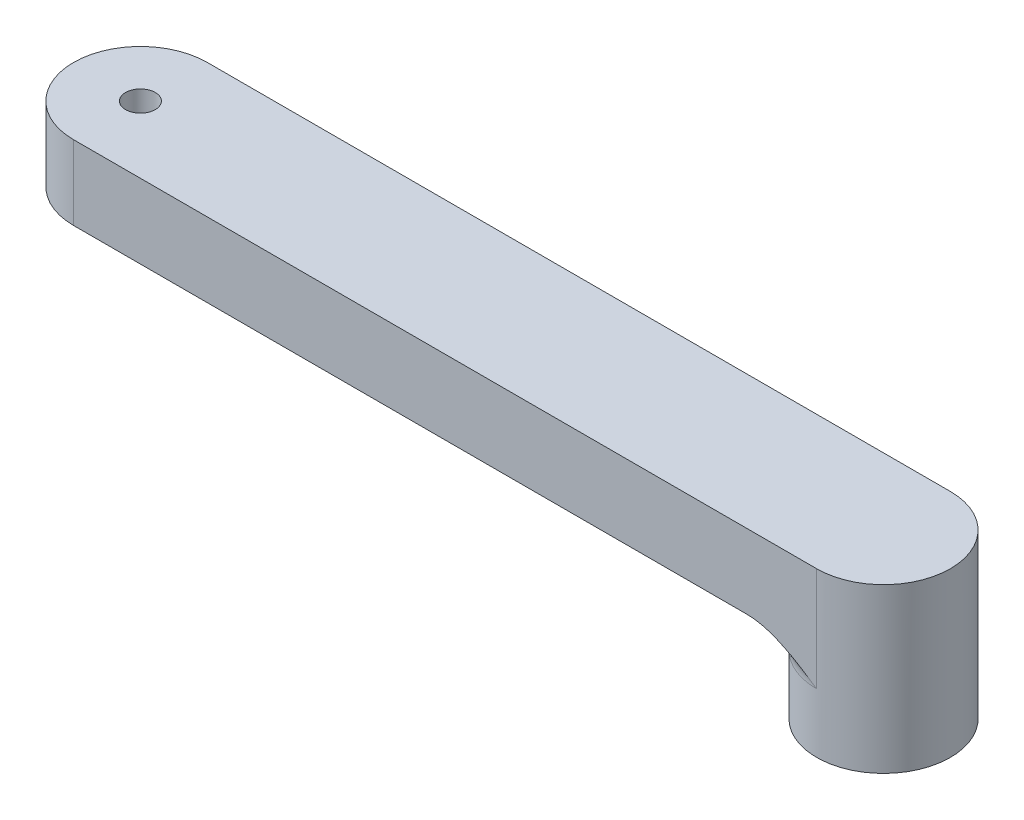
ISO-10303-21;
HEADER;
FILE_DESCRIPTION(('STEP AP214'),'2;1');
FILE_NAME('part.step','',(''),(''),'','','');
FILE_SCHEMA(('AUTOMOTIVE_DESIGN { 1 0 10303 214 1 1 1 1 }'));
ENDSEC;
DATA;
#1=APPLICATION_CONTEXT('core data for automotive mechanical design processes');
#2=APPLICATION_PROTOCOL_DEFINITION('international standard','automotive_design',2000,#1);
#3=PRODUCT_CONTEXT('',#1,'mechanical');
#4=PRODUCT('Part','Part','',(#3));
#5=PRODUCT_RELATED_PRODUCT_CATEGORY('part','',(#4));
#6=PRODUCT_DEFINITION_FORMATION('','',#4);
#7=PRODUCT_DEFINITION_CONTEXT('part definition',#1,'design');
#8=PRODUCT_DEFINITION('design','',#6,#7);
#9=PRODUCT_DEFINITION_SHAPE('','',#8);
#10=(LENGTH_UNIT() NAMED_UNIT(*) SI_UNIT(.MILLI.,.METRE.));
#11=(NAMED_UNIT(*) PLANE_ANGLE_UNIT() SI_UNIT($,.RADIAN.));
#12=(NAMED_UNIT(*) SI_UNIT($,.STERADIAN.) SOLID_ANGLE_UNIT());
#13=UNCERTAINTY_MEASURE_WITH_UNIT(LENGTH_MEASURE(1.E-05),#10,'distance_accuracy_value','');
#14=(GEOMETRIC_REPRESENTATION_CONTEXT(3) GLOBAL_UNCERTAINTY_ASSIGNED_CONTEXT((#13)) GLOBAL_UNIT_ASSIGNED_CONTEXT((#10,
#11,#12)) REPRESENTATION_CONTEXT('',''));
#15=CARTESIAN_POINT('',(0.,0.,0.));
#16=DIRECTION('',(0.,0.,1.));
#17=DIRECTION('',(1.,0.,0.));
#18=AXIS2_PLACEMENT_3D('',#15,#16,#17);
#19=CARTESIAN_POINT('',(-15.875,3.175,-0.600941078413044));
#20=DIRECTION('',(0.,-1.,0.));
#21=DIRECTION('',(0.,0.,-1.));
#22=AXIS2_PLACEMENT_3D('',#19,#20,#21);
#23=CYLINDRICAL_SURFACE('',#22,2.8575);
#24=CARTESIAN_POINT('',(-15.875,0.,-0.600941078413044));
#25=DIRECTION('',(0.,1.,0.));
#26=DIRECTION('',(0.,0.,1.));
#27=AXIS2_PLACEMENT_3D('',#24,#25,#26);
#28=CIRCLE('',#27,2.8575);
#29=CARTESIAN_POINT('',(-15.875,0.,-3.45844107841304));
#30=VERTEX_POINT('',#29);
#31=CARTESIAN_POINT('',(-15.875,0.,2.25655892158696));
#32=VERTEX_POINT('',#31);
#33=EDGE_CURVE('E128',#30,#32,#28,.T.);
#34=ORIENTED_EDGE('',*,*,#33,.T.);
#35=DIRECTION('',(0.,-1.,0.));
#36=VECTOR('',#35,1.);
#37=CARTESIAN_POINT('',(-15.875,3.175,2.25655892158696));
#38=LINE('',#37,#36);
#39=CARTESIAN_POINT('',(-15.875,3.175,2.25655892158696));
#40=VERTEX_POINT('',#39);
#41=EDGE_CURVE('E108',#40,#32,#38,.T.);
#42=ORIENTED_EDGE('',*,*,#41,.F.);
#43=CARTESIAN_POINT('',(-15.875,3.175,-0.600941078413044));
#44=DIRECTION('',(0.,1.,0.));
#45=DIRECTION('',(0.,0.,1.));
#46=AXIS2_PLACEMENT_3D('',#43,#44,#45);
#47=CIRCLE('',#46,2.8575);
#48=CARTESIAN_POINT('',(-15.875,3.175,-3.45844107841304));
#49=VERTEX_POINT('',#48);
#50=EDGE_CURVE('E115',#49,#40,#47,.T.);
#51=ORIENTED_EDGE('',*,*,#50,.F.);
#52=DIRECTION('',(0.,-1.,0.));
#53=VECTOR('',#52,1.);
#54=CARTESIAN_POINT('',(-15.875,3.175,-3.45844107841304));
#55=LINE('',#54,#53);
#56=EDGE_CURVE('E270',#49,#30,#55,.T.);
#57=ORIENTED_EDGE('',*,*,#56,.T.);
#58=EDGE_LOOP('',(#34,#42,#51,#57));
#59=FACE_BOUND('',#58,.T.);
#60=ADVANCED_FACE('F49',(#59),#23,.T.);
#61=CARTESIAN_POINT('',(-15.875,3.175,2.25655892158696));
#62=DIRECTION('',(0.,0.,-1.));
#63=DIRECTION('',(-1.,0.,0.));
#64=AXIS2_PLACEMENT_3D('',#61,#62,#63);
#65=PLANE('',#64);
#66=DIRECTION('',(1.,0.,0.));
#67=VECTOR('',#66,1.);
#68=CARTESIAN_POINT('',(-15.875,0.,2.25655892158696));
#69=LINE('',#68,#67);
#70=CARTESIAN_POINT('',(12.8965859925121,0.,2.25655892158696));
#71=VERTEX_POINT('',#70);
#72=EDGE_CURVE('E273',#32,#71,#69,.T.);
#73=ORIENTED_EDGE('',*,*,#72,.T.);
#74=CARTESIAN_POINT('',(12.8965859925121,0.,2.25655892158696));
#75=CARTESIAN_POINT('',(12.9772484220916,-1.04498852590206E-05,2.25655892158696));
#76=CARTESIAN_POINT('',(13.0578110711299,-0.00399855892930173,2.25655892158696));
#77=CARTESIAN_POINT('',(13.2181241792396,-0.0190364687245416,2.25655892158696));
#78=CARTESIAN_POINT('',(13.2978759412376,-0.0300721186207119,2.25655892158696));
#79=CARTESIAN_POINT('',(13.5327310814046,-0.0719509510735496,2.25655892158696));
#80=CARTESIAN_POINT('',(13.6862626959951,-0.111631363846945,2.25655892158696));
#81=CARTESIAN_POINT('',(14.0195949580068,-0.219332049589466,2.25655892158696));
#82=CARTESIAN_POINT('',(14.1979593931713,-0.291607484088059,2.25655892158696));
#83=CARTESIAN_POINT('',(14.5464286454786,-0.454130847421246,2.25655892158696));
#84=CARTESIAN_POINT('',(14.7165168470793,-0.544413213901088,2.25655892158696));
#85=CARTESIAN_POINT('',(15.2199207203796,-0.833356764345247,2.25655892158696));
#86=CARTESIAN_POINT('',(15.5432459530216,-1.04883131875326,2.25655892158696));
#87=CARTESIAN_POINT('',(15.8690696637531,-1.26604645971455,2.25655892158696));
#88=CARTESIAN_POINT('',(15.8720348466121,-1.26802324854572,2.25655892158696));
#89=CARTESIAN_POINT('',(15.875,-1.27,2.25655892158696));
#90=B_SPLINE_CURVE_WITH_KNOTS('',3,(#74,#75,#76,#77,#78,#79,#80,#81,#82,#83,#84,#85,#86,#87,#88,
#89),.UNSPECIFIED.,.F.,.F.,(4,2,2,2,2,2,2,4),(0.,0.2417368252129,0.482989783338449,
0.95711090501458,1.53301347412536,2.1100281845443,3.27409545326392,3.28478657108976),.UNSPECIFIED.);
#91=CARTESIAN_POINT('',(15.875,-1.27,2.25655892158696));
#92=VERTEX_POINT('',#91);
#93=EDGE_CURVE('E11',#71,#92,#90,.T.);
#94=ORIENTED_EDGE('',*,*,#93,.T.);
#95=DIRECTION('',(0.,-1.,0.));
#96=VECTOR('',#95,1.);
#97=CARTESIAN_POINT('',(15.875,3.175,2.25655892158696));
#98=LINE('',#97,#96);
#99=CARTESIAN_POINT('',(15.875,3.175,2.25655892158696));
#100=VERTEX_POINT('',#99);
#101=EDGE_CURVE('E110',#100,#92,#98,.T.);
#102=ORIENTED_EDGE('',*,*,#101,.F.);
#103=DIRECTION('',(1.,0.,0.));
#104=VECTOR('',#103,1.);
#105=CARTESIAN_POINT('',(-15.875,3.175,2.25655892158696));
#106=LINE('',#105,#104);
#107=EDGE_CURVE('E104',#40,#100,#106,.T.);
#108=ORIENTED_EDGE('',*,*,#107,.F.);
#109=ORIENTED_EDGE('',*,*,#41,.T.);
#110=EDGE_LOOP('',(#73,#94,#102,#108,#109));
#111=FACE_BOUND('',#110,.T.);
#112=ADVANCED_FACE('F106',(#111),#65,.F.);
#113=CARTESIAN_POINT('',(15.875,3.175,-0.600941078413044));
#114=DIRECTION('',(0.,-1.,0.));
#115=DIRECTION('',(0.,0.,-1.));
#116=AXIS2_PLACEMENT_3D('',#113,#114,#115);
#117=CYLINDRICAL_SURFACE('',#116,2.8575);
#118=CARTESIAN_POINT('',(15.875,-1.27,-0.600941078413044));
#119=DIRECTION('',(0.,1.,0.));
#120=DIRECTION('',(0.,0.,1.));
#121=AXIS2_PLACEMENT_3D('',#118,#119,#120);
#122=CIRCLE('',#121,2.8575);
#123=CARTESIAN_POINT('',(15.875,-1.27,-3.45844107841304));
#124=VERTEX_POINT('',#123);
#125=EDGE_CURVE('E130',#92,#124,#122,.F.);
#126=ORIENTED_EDGE('',*,*,#125,.T.);
#127=DIRECTION('',(0.,-1.,0.));
#128=VECTOR('',#127,1.);
#129=CARTESIAN_POINT('',(15.875,3.175,-3.45844107841304));
#130=LINE('',#129,#128);
#131=CARTESIAN_POINT('',(15.875,3.175,-3.45844107841304));
#132=VERTEX_POINT('',#131);
#133=EDGE_CURVE('E136',#132,#124,#130,.T.);
#134=ORIENTED_EDGE('',*,*,#133,.F.);
#135=CARTESIAN_POINT('',(15.875,3.175,-0.600941078413044));
#136=DIRECTION('',(0.,1.,0.));
#137=DIRECTION('',(0.,0.,-1.));
#138=AXIS2_PLACEMENT_3D('',#135,#136,#137);
#139=CIRCLE('',#138,2.8575);
#140=EDGE_CURVE('E114',#100,#132,#139,.T.);
#141=ORIENTED_EDGE('',*,*,#140,.F.);
#142=ORIENTED_EDGE('',*,*,#101,.T.);
#143=EDGE_LOOP('',(#126,#134,#141,#142));
#144=FACE_BOUND('',#143,.T.);
#145=CARTESIAN_POINT('',(15.875,-3.81,-0.600941078413044));
#146=DIRECTION('',(0.,-1.,0.));
#147=DIRECTION('',(0.,0.,-1.));
#148=AXIS2_PLACEMENT_3D('',#145,#146,#147);
#149=CIRCLE('',#148,2.8575);
#150=CARTESIAN_POINT('',(15.875,-3.81,-3.45844107841304));
#151=VERTEX_POINT('',#150);
#152=EDGE_CURVE('E259',#151,#151,#149,.T.);
#153=ORIENTED_EDGE('',*,*,#152,.F.);
#154=EDGE_LOOP('',(#153));
#155=FACE_BOUND('',#154,.T.);
#156=ADVANCED_FACE('F152',(#144,#155),#117,.T.);
#157=CARTESIAN_POINT('',(-15.875,3.175,-3.45844107841304));
#158=DIRECTION('',(0.,0.,1.));
#159=DIRECTION('',(1.,0.,0.));
#160=AXIS2_PLACEMENT_3D('',#157,#158,#159);
#161=PLANE('',#160);
#162=ORIENTED_EDGE('',*,*,#133,.T.);
#163=CARTESIAN_POINT('',(12.8965859925121,0.,-3.45844107841304));
#164=CARTESIAN_POINT('',(12.9772484220916,-1.0449885259034E-05,-3.45844107841304));
#165=CARTESIAN_POINT('',(13.0578110711299,-0.00399855892930176,-3.45844107841304));
#166=CARTESIAN_POINT('',(13.2181241792396,-0.0190364687245416,-3.45844107841304));
#167=CARTESIAN_POINT('',(13.2978759412376,-0.0300721186207119,-3.45844107841304));
#168=CARTESIAN_POINT('',(13.5327310814046,-0.0719509510735496,-3.45844107841304));
#169=CARTESIAN_POINT('',(13.6862626959951,-0.111631363846945,-3.45844107841304));
#170=CARTESIAN_POINT('',(14.0195949580068,-0.219332049589466,-3.45844107841304));
#171=CARTESIAN_POINT('',(14.1979593931713,-0.291607484088059,-3.45844107841304));
#172=CARTESIAN_POINT('',(14.5464286454786,-0.454130847421246,-3.45844107841304));
#173=CARTESIAN_POINT('',(14.7165168470793,-0.544413213901088,-3.45844107841304));
#174=CARTESIAN_POINT('',(15.2199207203796,-0.833356764345246,-3.45844107841304));
#175=CARTESIAN_POINT('',(15.5432459530216,-1.04883131875326,-3.45844107841304));
#176=CARTESIAN_POINT('',(15.8690696637531,-1.26604645971455,-3.45844107841304));
#177=CARTESIAN_POINT('',(15.8720348466121,-1.26802324854572,-3.45844107841304));
#178=CARTESIAN_POINT('',(15.875,-1.27,-3.45844107841304));
#179=B_SPLINE_CURVE_WITH_KNOTS('',3,(#163,#164,#165,#166,#167,#168,#169,#170,#171,#172,#173,
#174,#175,#176,#177,#178),.UNSPECIFIED.,.F.,.F.,(4,2,2,2,2,2,2,4),(0.,0.2417368252129,
0.482989783338449,0.957110905014581,1.53301347412536,2.1100281845443,3.27409545326392,
3.28478657108976),.UNSPECIFIED.);
#180=CARTESIAN_POINT('',(12.8965859925121,0.,-3.45844107841304));
#181=VERTEX_POINT('',#180);
#182=EDGE_CURVE('E64',#124,#181,#179,.F.);
#183=ORIENTED_EDGE('',*,*,#182,.T.);
#184=DIRECTION('',(-1.,0.,0.));
#185=VECTOR('',#184,1.);
#186=CARTESIAN_POINT('',(-15.875,0.,-3.45844107841304));
#187=LINE('',#186,#185);
#188=EDGE_CURVE('E125',#181,#30,#187,.T.);
#189=ORIENTED_EDGE('',*,*,#188,.T.);
#190=ORIENTED_EDGE('',*,*,#56,.F.);
#191=DIRECTION('',(-1.,0.,0.));
#192=VECTOR('',#191,1.);
#193=CARTESIAN_POINT('',(-15.875,3.175,-3.45844107841304));
#194=LINE('',#193,#192);
#195=EDGE_CURVE('E120',#132,#49,#194,.T.);
#196=ORIENTED_EDGE('',*,*,#195,.F.);
#197=EDGE_LOOP('',(#162,#183,#189,#190,#196));
#198=FACE_BOUND('',#197,.T.);
#199=ADVANCED_FACE('F147',(#198),#161,.F.);
#200=CARTESIAN_POINT('',(-15.875,3.175,-0.600941078413044));
#201=DIRECTION('',(0.,1.,0.));
#202=DIRECTION('',(0.,0.,1.));
#203=AXIS2_PLACEMENT_3D('',#200,#201,#202);
#204=PLANE('',#203);
#205=CARTESIAN_POINT('',(-15.875,3.175,-0.600941078413044));
#206=DIRECTION('',(0.,-1.,0.));
#207=DIRECTION('',(0.,0.,-1.));
#208=AXIS2_PLACEMENT_3D('',#205,#206,#207);
#209=CIRCLE('',#208,0.635000000000001);
#210=CARTESIAN_POINT('',(-15.875,3.175,-1.23594107841304));
#211=VERTEX_POINT('',#210);
#212=EDGE_CURVE('E245',#211,#211,#209,.T.);
#213=ORIENTED_EDGE('',*,*,#212,.T.);
#214=EDGE_LOOP('',(#213));
#215=FACE_BOUND('',#214,.T.);
#216=ORIENTED_EDGE('',*,*,#50,.T.);
#217=ORIENTED_EDGE('',*,*,#107,.T.);
#218=ORIENTED_EDGE('',*,*,#140,.T.);
#219=ORIENTED_EDGE('',*,*,#195,.T.);
#220=EDGE_LOOP('',(#216,#217,#218,#219));
#221=FACE_BOUND('',#220,.T.);
#222=ADVANCED_FACE('F118',(#215,#221),#204,.T.);
#223=CARTESIAN_POINT('',(-15.875,0.,-0.600941078413044));
#224=DIRECTION('',(0.,1.,0.));
#225=DIRECTION('',(0.,0.,1.));
#226=AXIS2_PLACEMENT_3D('',#223,#224,#225);
#227=PLANE('',#226);
#228=CARTESIAN_POINT('',(-15.875,0.,-0.600941078413044));
#229=DIRECTION('',(0.,-1.,0.));
#230=DIRECTION('',(0.,0.,-1.));
#231=AXIS2_PLACEMENT_3D('',#228,#229,#230);
#232=CIRCLE('',#231,0.635000000000001);
#233=CARTESIAN_POINT('',(-15.875,0.,-1.23594107841304));
#234=VERTEX_POINT('',#233);
#235=EDGE_CURVE('E248',#234,#234,#232,.T.);
#236=ORIENTED_EDGE('',*,*,#235,.F.);
#237=EDGE_LOOP('',(#236));
#238=FACE_BOUND('',#237,.T.);
#239=ORIENTED_EDGE('',*,*,#188,.F.);
#240=CARTESIAN_POINT('',(15.875,0.,-0.600941078413044));
#241=DIRECTION('',(0.,1.,0.));
#242=DIRECTION('',(0.,0.,1.));
#243=AXIS2_PLACEMENT_3D('',#240,#241,#242);
#244=CIRCLE('',#243,4.1275);
#245=EDGE_CURVE('E77',#181,#71,#244,.T.);
#246=ORIENTED_EDGE('',*,*,#245,.T.);
#247=ORIENTED_EDGE('',*,*,#72,.F.);
#248=ORIENTED_EDGE('',*,*,#33,.F.);
#249=EDGE_LOOP('',(#239,#246,#247,#248));
#250=FACE_BOUND('',#249,.T.);
#251=ADVANCED_FACE('F153',(#238,#250),#227,.F.);
#252=CARTESIAN_POINT('',(15.875,-3.81,-0.600941078413044));
#253=DIRECTION('',(0.,-1.,0.));
#254=DIRECTION('',(0.,0.,-1.));
#255=AXIS2_PLACEMENT_3D('',#252,#253,#254);
#256=PLANE('',#255);
#257=ORIENTED_EDGE('',*,*,#152,.T.);
#258=EDGE_LOOP('',(#257));
#259=FACE_BOUND('',#258,.T.);
#260=CARTESIAN_POINT('',(15.875,-3.81,-0.600941078413044));
#261=DIRECTION('',(0.,-1.,0.));
#262=DIRECTION('',(0.,0.,-1.));
#263=AXIS2_PLACEMENT_3D('',#260,#261,#262);
#264=CIRCLE('',#263,1.905);
#265=CARTESIAN_POINT('',(15.875,-3.81,1.30405892158696));
#266=VERTEX_POINT('',#265);
#267=EDGE_CURVE('E255',#266,#266,#264,.T.);
#268=ORIENTED_EDGE('',*,*,#267,.F.);
#269=EDGE_LOOP('',(#268));
#270=FACE_BOUND('',#269,.T.);
#271=ADVANCED_FACE('F167',(#259,#270),#256,.T.);
#272=CARTESIAN_POINT('',(15.875,-3.81,-0.600941078413044));
#273=DIRECTION('',(0.,1.,0.));
#274=DIRECTION('',(0.,0.,1.));
#275=AXIS2_PLACEMENT_3D('',#272,#273,#274);
#276=CYLINDRICAL_SURFACE('',#275,1.905);
#277=CARTESIAN_POINT('',(15.875,0.,-0.600941078413044));
#278=DIRECTION('',(0.,-1.,0.));
#279=DIRECTION('',(0.,0.,-1.));
#280=AXIS2_PLACEMENT_3D('',#277,#278,#279);
#281=CIRCLE('',#280,1.905);
#282=CARTESIAN_POINT('',(15.875,0.,1.30405892158696));
#283=VERTEX_POINT('',#282);
#284=EDGE_CURVE('E252',#283,#283,#281,.T.);
#285=CARTESIAN_POINT('',(15.875,-3.81,1.30405892158696));
#286=CARTESIAN_POINT('',(15.875,-3.7703125,1.30405892158696));
#287=CARTESIAN_POINT('',(15.875,-3.730625,1.30405892158696));
#288=CARTESIAN_POINT('',(15.875,-3.65125,1.30405892158696));
#289=CARTESIAN_POINT('',(15.875,-3.6115625,1.30405892158696));
#290=CARTESIAN_POINT('',(15.875,-3.5321875,1.30405892158696));
#291=CARTESIAN_POINT('',(15.875,-3.4925,1.30405892158696));
#292=CARTESIAN_POINT('',(15.875,-3.413125,1.30405892158696));
#293=CARTESIAN_POINT('',(15.875,-3.3734375,1.30405892158696));
#294=CARTESIAN_POINT('',(15.875,-3.2940625,1.30405892158696));
#295=CARTESIAN_POINT('',(15.875,-3.254375,1.30405892158696));
#296=CARTESIAN_POINT('',(15.875,-3.175,1.30405892158696));
#297=CARTESIAN_POINT('',(15.875,-3.1353125,1.30405892158696));
#298=CARTESIAN_POINT('',(15.875,-3.0559375,1.30405892158696));
#299=CARTESIAN_POINT('',(15.875,-3.01625,1.30405892158696));
#300=CARTESIAN_POINT('',(15.875,-2.936875,1.30405892158696));
#301=CARTESIAN_POINT('',(15.875,-2.8971875,1.30405892158696));
#302=CARTESIAN_POINT('',(15.875,-2.8178125,1.30405892158696));
#303=CARTESIAN_POINT('',(15.875,-2.778125,1.30405892158696));
#304=CARTESIAN_POINT('',(15.875,-2.69875,1.30405892158696));
#305=CARTESIAN_POINT('',(15.875,-2.6590625,1.30405892158696));
#306=CARTESIAN_POINT('',(15.875,-2.5796875,1.30405892158696));
#307=CARTESIAN_POINT('',(15.875,-2.54,1.30405892158696));
#308=CARTESIAN_POINT('',(15.875,-2.460625,1.30405892158696));
#309=CARTESIAN_POINT('',(15.875,-2.4209375,1.30405892158696));
#310=CARTESIAN_POINT('',(15.875,-2.3415625,1.30405892158696));
#311=CARTESIAN_POINT('',(15.875,-2.301875,1.30405892158696));
#312=CARTESIAN_POINT('',(15.875,-2.2225,1.30405892158696));
#313=CARTESIAN_POINT('',(15.875,-2.1828125,1.30405892158696));
#314=CARTESIAN_POINT('',(15.875,-2.1034375,1.30405892158696));
#315=CARTESIAN_POINT('',(15.875,-2.06375,1.30405892158696));
#316=CARTESIAN_POINT('',(15.875,-1.984375,1.30405892158696));
#317=CARTESIAN_POINT('',(15.875,-1.9446875,1.30405892158696));
#318=CARTESIAN_POINT('',(15.875,-1.8653125,1.30405892158696));
#319=CARTESIAN_POINT('',(15.875,-1.825625,1.30405892158696));
#320=CARTESIAN_POINT('',(15.875,-1.74625,1.30405892158696));
#321=CARTESIAN_POINT('',(15.875,-1.7065625,1.30405892158696));
#322=CARTESIAN_POINT('',(15.875,-1.6271875,1.30405892158696));
#323=CARTESIAN_POINT('',(15.875,-1.5875,1.30405892158696));
#324=CARTESIAN_POINT('',(15.875,-1.508125,1.30405892158696));
#325=CARTESIAN_POINT('',(15.875,-1.4684375,1.30405892158696));
#326=CARTESIAN_POINT('',(15.875,-1.3890625,1.30405892158696));
#327=CARTESIAN_POINT('',(15.875,-1.349375,1.30405892158696));
#328=CARTESIAN_POINT('',(15.875,-1.27,1.30405892158696));
#329=CARTESIAN_POINT('',(15.875,-1.2303125,1.30405892158696));
#330=CARTESIAN_POINT('',(15.875,-1.1509375,1.30405892158696));
#331=CARTESIAN_POINT('',(15.875,-1.11125,1.30405892158696));
#332=CARTESIAN_POINT('',(15.875,-1.031875,1.30405892158696));
#333=CARTESIAN_POINT('',(15.875,-0.9921875,1.30405892158696));
#334=CARTESIAN_POINT('',(15.875,-0.9128125,1.30405892158696));
#335=CARTESIAN_POINT('',(15.875,-0.873125,1.30405892158696));
#336=CARTESIAN_POINT('',(15.875,-0.79375,1.30405892158696));
#337=CARTESIAN_POINT('',(15.875,-0.7540625,1.30405892158696));
#338=CARTESIAN_POINT('',(15.875,-0.6746875,1.30405892158696));
#339=CARTESIAN_POINT('',(15.875,-0.635,1.30405892158696));
#340=CARTESIAN_POINT('',(15.875,-0.555625,1.30405892158696));
#341=CARTESIAN_POINT('',(15.875,-0.5159375,1.30405892158696));
#342=CARTESIAN_POINT('',(15.875,-0.4365625,1.30405892158696));
#343=CARTESIAN_POINT('',(15.875,-0.396875,1.30405892158696));
#344=CARTESIAN_POINT('',(15.875,-0.3175,1.30405892158696));
#345=CARTESIAN_POINT('',(15.875,-0.2778125,1.30405892158696));
#346=CARTESIAN_POINT('',(15.875,-0.1984375,1.30405892158696));
#347=CARTESIAN_POINT('',(15.875,-0.15875,1.30405892158696));
#348=CARTESIAN_POINT('',(15.875,-0.0793749999999999,1.30405892158696));
#349=CARTESIAN_POINT('',(15.875,-0.0396874999999999,1.30405892158696));
#350=CARTESIAN_POINT('',(15.875,0.,1.30405892158696));
#351=B_SPLINE_CURVE_WITH_KNOTS('',3,(#285,#286,#287,#288,#289,#290,#291,#292,#293,#294,#295,
#296,#297,#298,#299,#300,#301,#302,#303,#304,#305,#306,#307,#308,#309,#310,#311,#312,#313,#314,
#315,#316,#317,#318,#319,#320,#321,#322,#323,#324,#325,#326,#327,#328,#329,#330,#331,#332,#333,
#334,#335,#336,#337,#338,#339,#340,#341,#342,#343,#344,#345,#346,#347,#348,#349,#350),
.UNSPECIFIED.,.F.,.F.,(4,2,2,2,2,2,2,2,2,2,2,2,2,2,2,2,2,2,2,2,2,2,2,2,2,2,2,2,2,2,2,2,4),(0.,
0.1190625,0.238125,0.3571875,0.47625,0.5953125,0.714375,0.8334375,0.9525,1.0715625,1.190625,
1.3096875,1.42875,1.5478125,1.666875,1.7859375,1.905,2.0240625,2.143125,2.2621875,2.38125,
2.5003125,2.619375,2.7384375,2.8575,2.9765625,3.095625,3.2146875,3.33375,3.4528125,3.571875,
3.6909375,3.81),.UNSPECIFIED.);
#352=EDGE_CURVE('BSEAM171',#266,#283,#351,.T.);
#353=ORIENTED_EDGE('',*,*,#267,.T.);
#354=ORIENTED_EDGE('',*,*,#284,.F.);
#355=ORIENTED_EDGE('',*,*,#352,.T.);
#356=ORIENTED_EDGE('',*,*,#352,.F.);
#357=EDGE_LOOP('',(#353,#355,#354,#356));
#358=FACE_BOUND('',#357,.T.);
#359=ADVANCED_FACE('F171',(#358),#276,.F.);
#360=ORIENTED_EDGE('',*,*,#284,.T.);
#361=EDGE_LOOP('',(#360));
#362=FACE_BOUND('',#361,.T.);
#363=ADVANCED_FACE('F181',(#362),#227,.F.);
#364=CARTESIAN_POINT('',(15.875,-1.27,-0.600941078413044));
#365=DIRECTION('',(0.,1.,0.));
#366=DIRECTION('',(0.,0.,1.));
#367=AXIS2_PLACEMENT_3D('',#364,#365,#366);
#368=TOROIDAL_SURFACE('',#367,4.1275,1.27);
#369=ORIENTED_EDGE('',*,*,#93,.F.);
#370=ORIENTED_EDGE('',*,*,#245,.F.);
#371=ORIENTED_EDGE('',*,*,#182,.F.);
#372=ORIENTED_EDGE('',*,*,#125,.F.);
#373=EDGE_LOOP('',(#369,#370,#371,#372));
#374=FACE_BOUND('',#373,.T.);
#375=ADVANCED_FACE('F51',(#374),#368,.F.);
#376=CARTESIAN_POINT('',(-15.875,3.175,-0.600941078413044));
#377=DIRECTION('',(0.,-1.,0.));
#378=DIRECTION('',(0.,0.,-1.));
#379=AXIS2_PLACEMENT_3D('',#376,#377,#378);
#380=CYLINDRICAL_SURFACE('',#379,0.635000000000001);
#381=ORIENTED_EDGE('',*,*,#212,.F.);
#382=EDGE_LOOP('',(#381));
#383=FACE_BOUND('',#382,.T.);
#384=ORIENTED_EDGE('',*,*,#235,.T.);
#385=EDGE_LOOP('',(#384));
#386=FACE_BOUND('',#385,.T.);
#387=ADVANCED_FACE('F213',(#383,#386),#380,.F.);
#388=CLOSED_SHELL('',(#60,#112,#156,#199,#222,#251,#271,#359,#363,#375,#387));
#389=MANIFOLD_SOLID_BREP('B2',#388);
#390=ADVANCED_BREP_SHAPE_REPRESENTATION('',(#18,#389),#14);
#391=SHAPE_DEFINITION_REPRESENTATION(#9,#390);
ENDSEC;
END-ISO-10303-21;
